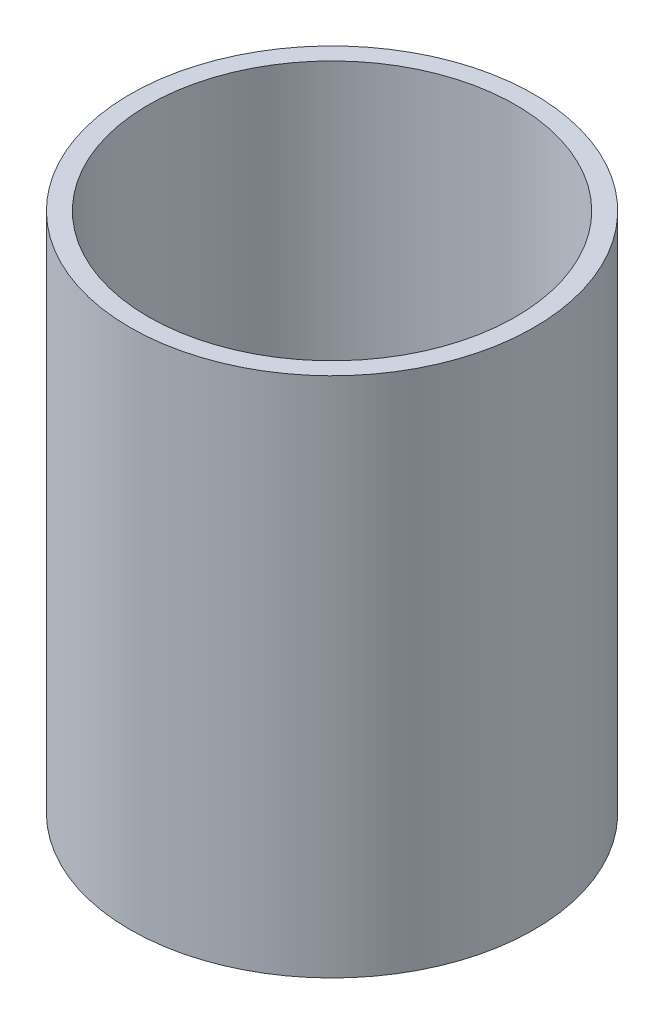
ISO-10303-21;
HEADER;
FILE_DESCRIPTION(('STEP AP214'),'2;1');
FILE_NAME('part.step','',(''),(''),'','','');
FILE_SCHEMA(('AUTOMOTIVE_DESIGN { 1 0 10303 214 1 1 1 1 }'));
ENDSEC;
DATA;
#1=APPLICATION_CONTEXT('core data for automotive mechanical design processes');
#2=APPLICATION_PROTOCOL_DEFINITION('international standard','automotive_design',2000,#1);
#3=PRODUCT_CONTEXT('',#1,'mechanical');
#4=PRODUCT('Part','Part','',(#3));
#5=PRODUCT_RELATED_PRODUCT_CATEGORY('part','',(#4));
#6=PRODUCT_DEFINITION_FORMATION('','',#4);
#7=PRODUCT_DEFINITION_CONTEXT('part definition',#1,'design');
#8=PRODUCT_DEFINITION('design','',#6,#7);
#9=PRODUCT_DEFINITION_SHAPE('','',#8);
#10=(LENGTH_UNIT() NAMED_UNIT(*) SI_UNIT(.MILLI.,.METRE.));
#11=(NAMED_UNIT(*) PLANE_ANGLE_UNIT() SI_UNIT($,.RADIAN.));
#12=(NAMED_UNIT(*) SI_UNIT($,.STERADIAN.) SOLID_ANGLE_UNIT());
#13=UNCERTAINTY_MEASURE_WITH_UNIT(LENGTH_MEASURE(1.E-05),#10,'distance_accuracy_value','');
#14=(GEOMETRIC_REPRESENTATION_CONTEXT(3) GLOBAL_UNCERTAINTY_ASSIGNED_CONTEXT((#13)) GLOBAL_UNIT_ASSIGNED_CONTEXT((#10,
#11,#12)) REPRESENTATION_CONTEXT('',''));
#15=CARTESIAN_POINT('',(0.,0.,0.));
#16=DIRECTION('',(0.,0.,1.));
#17=DIRECTION('',(1.,0.,0.));
#18=AXIS2_PLACEMENT_3D('',#15,#16,#17);
#19=CARTESIAN_POINT('',(0.,71.,0.));
#20=DIRECTION('',(0.,1.,0.));
#21=DIRECTION('',(0.,0.,1.));
#22=AXIS2_PLACEMENT_3D('',#19,#20,#21);
#23=PLANE('',#22);
#24=CARTESIAN_POINT('',(0.,71.,0.));
#25=DIRECTION('',(0.,1.,0.));
#26=DIRECTION('',(0.,0.,1.));
#27=AXIS2_PLACEMENT_3D('',#24,#25,#26);
#28=CIRCLE('',#27,27.5);
#29=CARTESIAN_POINT('',(0.,71.,27.5));
#30=VERTEX_POINT('',#29);
#31=EDGE_CURVE('E10',#30,#30,#28,.T.);
#32=ORIENTED_EDGE('',*,*,#31,.T.);
#33=EDGE_LOOP('',(#32));
#34=FACE_BOUND('',#33,.T.);
#35=CARTESIAN_POINT('',(0.,71.,0.));
#36=DIRECTION('',(0.,1.,0.));
#37=DIRECTION('',(0.,0.,1.));
#38=AXIS2_PLACEMENT_3D('',#35,#36,#37);
#39=CIRCLE('',#38,25.);
#40=CARTESIAN_POINT('',(0.,71.,25.));
#41=VERTEX_POINT('',#40);
#42=EDGE_CURVE('E54',#41,#41,#39,.T.);
#43=ORIENTED_EDGE('',*,*,#42,.F.);
#44=EDGE_LOOP('',(#43));
#45=FACE_BOUND('',#44,.T.);
#46=ADVANCED_FACE('F41',(#34,#45),#23,.T.);
#47=CARTESIAN_POINT('',(0.,0.,0.));
#48=DIRECTION('',(0.,1.,0.));
#49=DIRECTION('',(0.,0.,1.));
#50=AXIS2_PLACEMENT_3D('',#47,#48,#49);
#51=PLANE('',#50);
#52=CARTESIAN_POINT('',(0.,0.,0.));
#53=DIRECTION('',(0.,1.,0.));
#54=DIRECTION('',(0.,0.,1.));
#55=AXIS2_PLACEMENT_3D('',#52,#53,#54);
#56=CIRCLE('',#55,27.5);
#57=CARTESIAN_POINT('',(0.,0.,27.5));
#58=VERTEX_POINT('',#57);
#59=EDGE_CURVE('E45',#58,#58,#56,.T.);
#60=ORIENTED_EDGE('',*,*,#59,.F.);
#61=EDGE_LOOP('',(#60));
#62=FACE_BOUND('',#61,.T.);
#63=CARTESIAN_POINT('',(0.,0.,0.));
#64=DIRECTION('',(0.,1.,0.));
#65=DIRECTION('',(0.,0.,1.));
#66=AXIS2_PLACEMENT_3D('',#63,#64,#65);
#67=CIRCLE('',#66,25.);
#68=CARTESIAN_POINT('',(0.,0.,25.));
#69=VERTEX_POINT('',#68);
#70=EDGE_CURVE('E56',#69,#69,#67,.T.);
#71=ORIENTED_EDGE('',*,*,#70,.T.);
#72=EDGE_LOOP('',(#71));
#73=FACE_BOUND('',#72,.T.);
#74=ADVANCED_FACE('F68',(#62,#73),#51,.F.);
#75=CARTESIAN_POINT('',(0.,71.,0.));
#76=DIRECTION('',(0.,-1.,0.));
#77=DIRECTION('',(0.,0.,-1.));
#78=AXIS2_PLACEMENT_3D('',#75,#76,#77);
#79=CYLINDRICAL_SURFACE('',#78,27.5);
#80=ORIENTED_EDGE('',*,*,#31,.F.);
#81=EDGE_LOOP('',(#80));
#82=FACE_BOUND('',#81,.T.);
#83=ORIENTED_EDGE('',*,*,#59,.T.);
#84=EDGE_LOOP('',(#83));
#85=FACE_BOUND('',#84,.T.);
#86=ADVANCED_FACE('F43',(#82,#85),#79,.T.);
#87=CARTESIAN_POINT('',(0.,71.,0.));
#88=DIRECTION('',(0.,-1.,0.));
#89=DIRECTION('',(0.,0.,-1.));
#90=AXIS2_PLACEMENT_3D('',#87,#88,#89);
#91=CYLINDRICAL_SURFACE('',#90,25.);
#92=ORIENTED_EDGE('',*,*,#42,.T.);
#93=EDGE_LOOP('',(#92));
#94=FACE_BOUND('',#93,.T.);
#95=ORIENTED_EDGE('',*,*,#70,.F.);
#96=EDGE_LOOP('',(#95));
#97=FACE_BOUND('',#96,.T.);
#98=ADVANCED_FACE('F64',(#94,#97),#91,.F.);
#99=CLOSED_SHELL('',(#46,#74,#86,#98));
#100=MANIFOLD_SOLID_BREP('B2',#99);
#101=ADVANCED_BREP_SHAPE_REPRESENTATION('',(#18,#100),#14);
#102=SHAPE_DEFINITION_REPRESENTATION(#9,#101);
ENDSEC;
END-ISO-10303-21;
